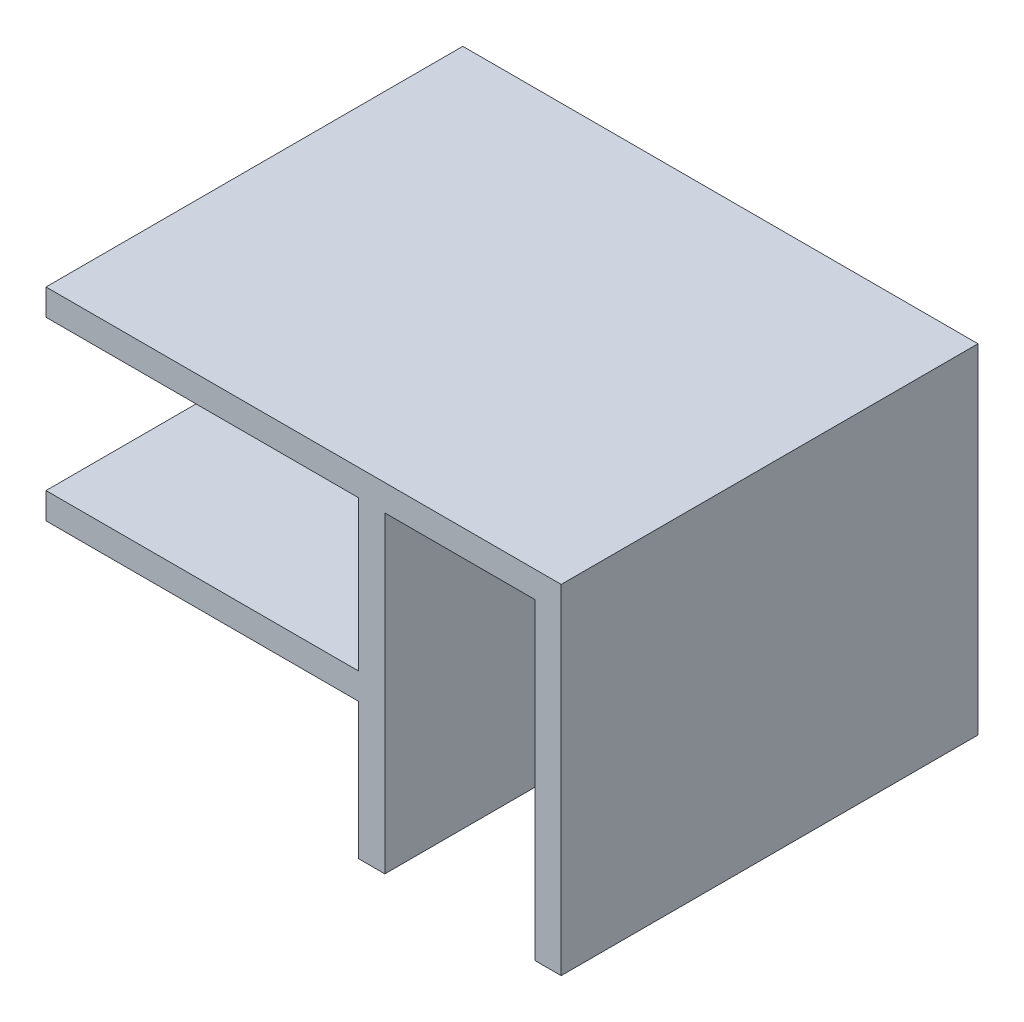
ISO-10303-21;
HEADER;
FILE_DESCRIPTION(('STEP AP214'),'2;1');
FILE_NAME('part.step','',(''),(''),'','','');
FILE_SCHEMA(('AUTOMOTIVE_DESIGN { 1 0 10303 214 1 1 1 1 }'));
ENDSEC;
DATA;
#1=APPLICATION_CONTEXT('core data for automotive mechanical design processes');
#2=APPLICATION_PROTOCOL_DEFINITION('international standard','automotive_design',2000,#1);
#3=PRODUCT_CONTEXT('',#1,'mechanical');
#4=PRODUCT('Part','Part','',(#3));
#5=PRODUCT_RELATED_PRODUCT_CATEGORY('part','',(#4));
#6=PRODUCT_DEFINITION_FORMATION('','',#4);
#7=PRODUCT_DEFINITION_CONTEXT('part definition',#1,'design');
#8=PRODUCT_DEFINITION('design','',#6,#7);
#9=PRODUCT_DEFINITION_SHAPE('','',#8);
#10=(LENGTH_UNIT() NAMED_UNIT(*) SI_UNIT(.MILLI.,.METRE.));
#11=(NAMED_UNIT(*) PLANE_ANGLE_UNIT() SI_UNIT($,.RADIAN.));
#12=(NAMED_UNIT(*) SI_UNIT($,.STERADIAN.) SOLID_ANGLE_UNIT());
#13=UNCERTAINTY_MEASURE_WITH_UNIT(LENGTH_MEASURE(1.E-05),#10,'distance_accuracy_value','');
#14=(GEOMETRIC_REPRESENTATION_CONTEXT(3) GLOBAL_UNCERTAINTY_ASSIGNED_CONTEXT((#13)) GLOBAL_UNIT_ASSIGNED_CONTEXT((#10,
#11,#12)) REPRESENTATION_CONTEXT('',''));
#15=CARTESIAN_POINT('',(0.,0.,0.));
#16=DIRECTION('',(0.,0.,1.));
#17=DIRECTION('',(1.,0.,0.));
#18=AXIS2_PLACEMENT_3D('',#15,#16,#17);
#19=CARTESIAN_POINT('',(0.8,0.,12.7));
#20=DIRECTION('',(0.,1.,0.));
#21=DIRECTION('',(-1.,0.,0.));
#22=AXIS2_PLACEMENT_3D('',#19,#20,#21);
#23=PLANE('',#22);
#24=DIRECTION('',(1.,0.,0.));
#25=VECTOR('',#24,1.);
#26=CARTESIAN_POINT('',(0.8,0.,0.));
#27=LINE('',#26,#25);
#28=CARTESIAN_POINT('',(0.,0.,0.));
#29=VERTEX_POINT('',#28);
#30=CARTESIAN_POINT('',(0.8,0.,0.));
#31=VERTEX_POINT('',#30);
#32=EDGE_CURVE('E165',#29,#31,#27,.T.);
#33=ORIENTED_EDGE('',*,*,#32,.T.);
#34=DIRECTION('',(0.,0.,-1.));
#35=VECTOR('',#34,1.);
#36=CARTESIAN_POINT('',(0.8,0.,12.7));
#37=LINE('',#36,#35);
#38=CARTESIAN_POINT('',(0.8,0.,12.7));
#39=VERTEX_POINT('',#38);
#40=EDGE_CURVE('E11',#39,#31,#37,.T.);
#41=ORIENTED_EDGE('',*,*,#40,.F.);
#42=DIRECTION('',(1.,0.,0.));
#43=VECTOR('',#42,1.);
#44=CARTESIAN_POINT('',(0.8,0.,12.7));
#45=LINE('',#44,#43);
#46=CARTESIAN_POINT('',(0.,0.,12.7));
#47=VERTEX_POINT('',#46);
#48=EDGE_CURVE('E191',#47,#39,#45,.T.);
#49=ORIENTED_EDGE('',*,*,#48,.F.);
#50=DIRECTION('',(0.,0.,-1.));
#51=VECTOR('',#50,1.);
#52=CARTESIAN_POINT('',(0.,0.,12.7));
#53=LINE('',#52,#51);
#54=EDGE_CURVE('E161',#47,#29,#53,.T.);
#55=ORIENTED_EDGE('',*,*,#54,.T.);
#56=EDGE_LOOP('',(#33,#41,#49,#55));
#57=FACE_BOUND('',#56,.T.);
#58=ADVANCED_FACE('F33',(#57),#23,.F.);
#59=CARTESIAN_POINT('',(0.799999999999998,9.525,12.7));
#60=DIRECTION('',(-1.,0.,0.));
#61=DIRECTION('',(0.,-1.,0.));
#62=AXIS2_PLACEMENT_3D('',#59,#60,#61);
#63=PLANE('',#62);
#64=DIRECTION('',(0.,1.,0.));
#65=VECTOR('',#64,1.);
#66=CARTESIAN_POINT('',(0.799999999999998,9.525,0.));
#67=LINE('',#66,#65);
#68=CARTESIAN_POINT('',(0.799999999999998,9.525,0.));
#69=VERTEX_POINT('',#68);
#70=EDGE_CURVE('E168',#31,#69,#67,.T.);
#71=ORIENTED_EDGE('',*,*,#70,.T.);
#72=DIRECTION('',(0.,0.,-1.));
#73=VECTOR('',#72,1.);
#74=CARTESIAN_POINT('',(0.799999999999998,9.525,12.7));
#75=LINE('',#74,#73);
#76=CARTESIAN_POINT('',(0.799999999999998,9.525,12.7));
#77=VERTEX_POINT('',#76);
#78=EDGE_CURVE('E41',#77,#69,#75,.T.);
#79=ORIENTED_EDGE('',*,*,#78,.F.);
#80=DIRECTION('',(0.,1.,0.));
#81=VECTOR('',#80,1.);
#82=CARTESIAN_POINT('',(0.799999999999998,9.525,12.7));
#83=LINE('',#82,#81);
#84=EDGE_CURVE('E110',#39,#77,#83,.T.);
#85=ORIENTED_EDGE('',*,*,#84,.F.);
#86=ORIENTED_EDGE('',*,*,#40,.T.);
#87=EDGE_LOOP('',(#71,#79,#85,#86));
#88=FACE_BOUND('',#87,.T.);
#89=ADVANCED_FACE('F279',(#88),#63,.F.);
#90=CARTESIAN_POINT('',(5.372,9.525,12.7));
#91=DIRECTION('',(0.,1.,0.));
#92=DIRECTION('',(0.,0.,1.));
#93=AXIS2_PLACEMENT_3D('',#90,#91,#92);
#94=PLANE('',#93);
#95=DIRECTION('',(1.,0.,0.));
#96=VECTOR('',#95,1.);
#97=CARTESIAN_POINT('',(5.372,9.525,0.));
#98=LINE('',#97,#96);
#99=CARTESIAN_POINT('',(5.372,9.525,0.));
#100=VERTEX_POINT('',#99);
#101=EDGE_CURVE('E170',#69,#100,#98,.T.);
#102=ORIENTED_EDGE('',*,*,#101,.T.);
#103=DIRECTION('',(0.,0.,-1.));
#104=VECTOR('',#103,1.);
#105=CARTESIAN_POINT('',(5.372,9.525,12.7));
#106=LINE('',#105,#104);
#107=CARTESIAN_POINT('',(5.372,9.525,12.7));
#108=VERTEX_POINT('',#107);
#109=EDGE_CURVE('E216',#108,#100,#106,.T.);
#110=ORIENTED_EDGE('',*,*,#109,.F.);
#111=DIRECTION('',(1.,0.,0.));
#112=VECTOR('',#111,1.);
#113=CARTESIAN_POINT('',(5.372,9.525,12.7));
#114=LINE('',#113,#112);
#115=EDGE_CURVE('E224',#77,#108,#114,.T.);
#116=ORIENTED_EDGE('',*,*,#115,.F.);
#117=ORIENTED_EDGE('',*,*,#78,.T.);
#118=EDGE_LOOP('',(#102,#110,#116,#117));
#119=FACE_BOUND('',#118,.T.);
#120=ADVANCED_FACE('F222',(#119),#94,.F.);
#121=CARTESIAN_POINT('',(5.372,0.,12.7));
#122=DIRECTION('',(1.,0.,0.));
#123=DIRECTION('',(0.,0.,-1.));
#124=AXIS2_PLACEMENT_3D('',#121,#122,#123);
#125=PLANE('',#124);
#126=DIRECTION('',(0.,-1.,0.));
#127=VECTOR('',#126,1.);
#128=CARTESIAN_POINT('',(5.372,0.,0.));
#129=LINE('',#128,#127);
#130=CARTESIAN_POINT('',(5.372,0.,0.));
#131=VERTEX_POINT('',#130);
#132=EDGE_CURVE('E172',#100,#131,#129,.T.);
#133=ORIENTED_EDGE('',*,*,#132,.T.);
#134=DIRECTION('',(0.,0.,-1.));
#135=VECTOR('',#134,1.);
#136=CARTESIAN_POINT('',(5.372,0.,12.7));
#137=LINE('',#136,#135);
#138=CARTESIAN_POINT('',(5.372,0.,12.7));
#139=VERTEX_POINT('',#138);
#140=EDGE_CURVE('E213',#139,#131,#137,.T.);
#141=ORIENTED_EDGE('',*,*,#140,.F.);
#142=DIRECTION('',(0.,-1.,0.));
#143=VECTOR('',#142,1.);
#144=CARTESIAN_POINT('',(5.372,0.,12.7));
#145=LINE('',#144,#143);
#146=EDGE_CURVE('E242',#108,#139,#145,.T.);
#147=ORIENTED_EDGE('',*,*,#146,.F.);
#148=ORIENTED_EDGE('',*,*,#109,.T.);
#149=EDGE_LOOP('',(#133,#141,#147,#148));
#150=FACE_BOUND('',#149,.T.);
#151=ADVANCED_FACE('F233',(#150),#125,.F.);
#152=CARTESIAN_POINT('',(6.172,0.,12.7));
#153=DIRECTION('',(0.,1.,0.));
#154=DIRECTION('',(-1.,0.,0.));
#155=AXIS2_PLACEMENT_3D('',#152,#153,#154);
#156=PLANE('',#155);
#157=DIRECTION('',(1.,0.,0.));
#158=VECTOR('',#157,1.);
#159=CARTESIAN_POINT('',(6.172,0.,0.));
#160=LINE('',#159,#158);
#161=CARTESIAN_POINT('',(6.172,0.,0.));
#162=VERTEX_POINT('',#161);
#163=EDGE_CURVE('E174',#131,#162,#160,.T.);
#164=ORIENTED_EDGE('',*,*,#163,.T.);
#165=DIRECTION('',(0.,0.,-1.));
#166=VECTOR('',#165,1.);
#167=CARTESIAN_POINT('',(6.172,0.,12.7));
#168=LINE('',#167,#166);
#169=CARTESIAN_POINT('',(6.172,0.,12.7));
#170=VERTEX_POINT('',#169);
#171=EDGE_CURVE('E210',#170,#162,#168,.T.);
#172=ORIENTED_EDGE('',*,*,#171,.F.);
#173=DIRECTION('',(1.,0.,0.));
#174=VECTOR('',#173,1.);
#175=CARTESIAN_POINT('',(6.172,0.,12.7));
#176=LINE('',#175,#174);
#177=EDGE_CURVE('E239',#139,#170,#176,.T.);
#178=ORIENTED_EDGE('',*,*,#177,.F.);
#179=ORIENTED_EDGE('',*,*,#140,.T.);
#180=EDGE_LOOP('',(#164,#172,#178,#179));
#181=FACE_BOUND('',#180,.T.);
#182=ADVANCED_FACE('F237',(#181),#156,.F.);
#183=CARTESIAN_POINT('',(6.172,10.325,12.7));
#184=DIRECTION('',(-1.,0.,0.));
#185=DIRECTION('',(0.,-1.,0.));
#186=AXIS2_PLACEMENT_3D('',#183,#184,#185);
#187=PLANE('',#186);
#188=DIRECTION('',(0.,1.,0.));
#189=VECTOR('',#188,1.);
#190=CARTESIAN_POINT('',(6.172,10.325,0.));
#191=LINE('',#190,#189);
#192=CARTESIAN_POINT('',(6.172,10.325,0.));
#193=VERTEX_POINT('',#192);
#194=EDGE_CURVE('E176',#162,#193,#191,.T.);
#195=ORIENTED_EDGE('',*,*,#194,.T.);
#196=DIRECTION('',(0.,0.,-1.));
#197=VECTOR('',#196,1.);
#198=CARTESIAN_POINT('',(6.172,10.325,12.7));
#199=LINE('',#198,#197);
#200=CARTESIAN_POINT('',(6.172,10.325,12.7));
#201=VERTEX_POINT('',#200);
#202=EDGE_CURVE('E207',#201,#193,#199,.T.);
#203=ORIENTED_EDGE('',*,*,#202,.F.);
#204=DIRECTION('',(0.,1.,0.));
#205=VECTOR('',#204,1.);
#206=CARTESIAN_POINT('',(6.172,10.325,12.7));
#207=LINE('',#206,#205);
#208=EDGE_CURVE('E241',#170,#201,#207,.T.);
#209=ORIENTED_EDGE('',*,*,#208,.F.);
#210=ORIENTED_EDGE('',*,*,#171,.T.);
#211=EDGE_LOOP('',(#195,#203,#209,#210));
#212=FACE_BOUND('',#211,.T.);
#213=ADVANCED_FACE('F292',(#212),#187,.F.);
#214=CARTESIAN_POINT('',(-9.525,10.325,12.7));
#215=DIRECTION('',(0.,-1.,0.));
#216=DIRECTION('',(0.,0.,-1.));
#217=AXIS2_PLACEMENT_3D('',#214,#215,#216);
#218=PLANE('',#217);
#219=DIRECTION('',(-1.,0.,0.));
#220=VECTOR('',#219,1.);
#221=CARTESIAN_POINT('',(-9.525,10.325,0.));
#222=LINE('',#221,#220);
#223=CARTESIAN_POINT('',(-9.525,10.325,0.));
#224=VERTEX_POINT('',#223);
#225=EDGE_CURVE('E178',#193,#224,#222,.T.);
#226=ORIENTED_EDGE('',*,*,#225,.T.);
#227=DIRECTION('',(0.,0.,-1.));
#228=VECTOR('',#227,1.);
#229=CARTESIAN_POINT('',(-9.525,10.325,12.7));
#230=LINE('',#229,#228);
#231=CARTESIAN_POINT('',(-9.525,10.325,12.7));
#232=VERTEX_POINT('',#231);
#233=EDGE_CURVE('E204',#232,#224,#230,.T.);
#234=ORIENTED_EDGE('',*,*,#233,.F.);
#235=DIRECTION('',(-1.,0.,0.));
#236=VECTOR('',#235,1.);
#237=CARTESIAN_POINT('',(-9.525,10.325,12.7));
#238=LINE('',#237,#236);
#239=EDGE_CURVE('E244',#201,#232,#238,.T.);
#240=ORIENTED_EDGE('',*,*,#239,.F.);
#241=ORIENTED_EDGE('',*,*,#202,.T.);
#242=EDGE_LOOP('',(#226,#234,#240,#241));
#243=FACE_BOUND('',#242,.T.);
#244=ADVANCED_FACE('F295',(#243),#218,.F.);
#245=CARTESIAN_POINT('',(-9.525,9.525,12.7));
#246=DIRECTION('',(1.,0.,0.));
#247=DIRECTION('',(0.,0.,-1.));
#248=AXIS2_PLACEMENT_3D('',#245,#246,#247);
#249=PLANE('',#248);
#250=DIRECTION('',(0.,-1.,0.));
#251=VECTOR('',#250,1.);
#252=CARTESIAN_POINT('',(-9.525,9.525,0.));
#253=LINE('',#252,#251);
#254=CARTESIAN_POINT('',(-9.525,9.525,0.));
#255=VERTEX_POINT('',#254);
#256=EDGE_CURVE('E180',#224,#255,#253,.T.);
#257=ORIENTED_EDGE('',*,*,#256,.T.);
#258=DIRECTION('',(0.,0.,-1.));
#259=VECTOR('',#258,1.);
#260=CARTESIAN_POINT('',(-9.525,9.525,12.7));
#261=LINE('',#260,#259);
#262=CARTESIAN_POINT('',(-9.525,9.525,12.7));
#263=VERTEX_POINT('',#262);
#264=EDGE_CURVE('E201',#263,#255,#261,.T.);
#265=ORIENTED_EDGE('',*,*,#264,.F.);
#266=DIRECTION('',(0.,-1.,0.));
#267=VECTOR('',#266,1.);
#268=CARTESIAN_POINT('',(-9.525,9.525,12.7));
#269=LINE('',#268,#267);
#270=EDGE_CURVE('E250',#232,#263,#269,.T.);
#271=ORIENTED_EDGE('',*,*,#270,.F.);
#272=ORIENTED_EDGE('',*,*,#233,.T.);
#273=EDGE_LOOP('',(#257,#265,#271,#272));
#274=FACE_BOUND('',#273,.T.);
#275=ADVANCED_FACE('F299',(#274),#249,.F.);
#276=CARTESIAN_POINT('',(0.,9.525,12.7));
#277=DIRECTION('',(0.,1.,0.));
#278=DIRECTION('',(-1.,0.,0.));
#279=AXIS2_PLACEMENT_3D('',#276,#277,#278);
#280=PLANE('',#279);
#281=DIRECTION('',(1.,0.,0.));
#282=VECTOR('',#281,1.);
#283=CARTESIAN_POINT('',(0.,9.525,0.));
#284=LINE('',#283,#282);
#285=CARTESIAN_POINT('',(0.,9.525,0.));
#286=VERTEX_POINT('',#285);
#287=EDGE_CURVE('E182',#255,#286,#284,.T.);
#288=ORIENTED_EDGE('',*,*,#287,.T.);
#289=DIRECTION('',(0.,0.,-1.));
#290=VECTOR('',#289,1.);
#291=CARTESIAN_POINT('',(0.,9.525,12.7));
#292=LINE('',#291,#290);
#293=CARTESIAN_POINT('',(0.,9.525,12.7));
#294=VERTEX_POINT('',#293);
#295=EDGE_CURVE('E198',#294,#286,#292,.T.);
#296=ORIENTED_EDGE('',*,*,#295,.F.);
#297=DIRECTION('',(1.,0.,0.));
#298=VECTOR('',#297,1.);
#299=CARTESIAN_POINT('',(0.,9.525,12.7));
#300=LINE('',#299,#298);
#301=EDGE_CURVE('E252',#263,#294,#300,.T.);
#302=ORIENTED_EDGE('',*,*,#301,.F.);
#303=ORIENTED_EDGE('',*,*,#264,.T.);
#304=EDGE_LOOP('',(#288,#296,#302,#303));
#305=FACE_BOUND('',#304,.T.);
#306=ADVANCED_FACE('F303',(#305),#280,.F.);
#307=CARTESIAN_POINT('',(0.,4.953,12.7));
#308=DIRECTION('',(1.,0.,0.));
#309=DIRECTION('',(0.,1.,0.));
#310=AXIS2_PLACEMENT_3D('',#307,#308,#309);
#311=PLANE('',#310);
#312=DIRECTION('',(0.,-1.,0.));
#313=VECTOR('',#312,1.);
#314=CARTESIAN_POINT('',(0.,4.953,0.));
#315=LINE('',#314,#313);
#316=CARTESIAN_POINT('',(0.,4.953,0.));
#317=VERTEX_POINT('',#316);
#318=EDGE_CURVE('E184',#286,#317,#315,.T.);
#319=ORIENTED_EDGE('',*,*,#318,.T.);
#320=DIRECTION('',(0.,0.,-1.));
#321=VECTOR('',#320,1.);
#322=CARTESIAN_POINT('',(0.,4.953,12.7));
#323=LINE('',#322,#321);
#324=CARTESIAN_POINT('',(0.,4.953,12.7));
#325=VERTEX_POINT('',#324);
#326=EDGE_CURVE('E195',#325,#317,#323,.T.);
#327=ORIENTED_EDGE('',*,*,#326,.F.);
#328=DIRECTION('',(0.,-1.,0.));
#329=VECTOR('',#328,1.);
#330=CARTESIAN_POINT('',(0.,4.953,12.7));
#331=LINE('',#330,#329);
#332=EDGE_CURVE('E254',#294,#325,#331,.T.);
#333=ORIENTED_EDGE('',*,*,#332,.F.);
#334=ORIENTED_EDGE('',*,*,#295,.T.);
#335=EDGE_LOOP('',(#319,#327,#333,#334));
#336=FACE_BOUND('',#335,.T.);
#337=ADVANCED_FACE('F260',(#336),#311,.F.);
#338=CARTESIAN_POINT('',(-9.525,4.953,12.7));
#339=DIRECTION('',(0.,-1.,0.));
#340=DIRECTION('',(0.,0.,-1.));
#341=AXIS2_PLACEMENT_3D('',#338,#339,#340);
#342=PLANE('',#341);
#343=DIRECTION('',(-1.,0.,0.));
#344=VECTOR('',#343,1.);
#345=CARTESIAN_POINT('',(-9.525,4.953,0.));
#346=LINE('',#345,#344);
#347=CARTESIAN_POINT('',(-9.525,4.953,0.));
#348=VERTEX_POINT('',#347);
#349=EDGE_CURVE('E186',#317,#348,#346,.T.);
#350=ORIENTED_EDGE('',*,*,#349,.T.);
#351=DIRECTION('',(0.,0.,-1.));
#352=VECTOR('',#351,1.);
#353=CARTESIAN_POINT('',(-9.525,4.953,12.7));
#354=LINE('',#353,#352);
#355=CARTESIAN_POINT('',(-9.525,4.953,12.7));
#356=VERTEX_POINT('',#355);
#357=EDGE_CURVE('E156',#356,#348,#354,.T.);
#358=ORIENTED_EDGE('',*,*,#357,.F.);
#359=DIRECTION('',(-1.,0.,0.));
#360=VECTOR('',#359,1.);
#361=CARTESIAN_POINT('',(-9.525,4.953,12.7));
#362=LINE('',#361,#360);
#363=EDGE_CURVE('E147',#325,#356,#362,.T.);
#364=ORIENTED_EDGE('',*,*,#363,.F.);
#365=ORIENTED_EDGE('',*,*,#326,.T.);
#366=EDGE_LOOP('',(#350,#358,#364,#365));
#367=FACE_BOUND('',#366,.T.);
#368=ADVANCED_FACE('F264',(#367),#342,.F.);
#369=CARTESIAN_POINT('',(-9.525,4.153,12.7));
#370=DIRECTION('',(1.,0.,0.));
#371=DIRECTION('',(0.,0.,-1.));
#372=AXIS2_PLACEMENT_3D('',#369,#370,#371);
#373=PLANE('',#372);
#374=DIRECTION('',(0.,-1.,0.));
#375=VECTOR('',#374,1.);
#376=CARTESIAN_POINT('',(-9.525,4.153,0.));
#377=LINE('',#376,#375);
#378=CARTESIAN_POINT('',(-9.525,4.153,0.));
#379=VERTEX_POINT('',#378);
#380=EDGE_CURVE('E155',#348,#379,#377,.T.);
#381=ORIENTED_EDGE('',*,*,#380,.T.);
#382=DIRECTION('',(0.,0.,-1.));
#383=VECTOR('',#382,1.);
#384=CARTESIAN_POINT('',(-9.525,4.153,12.7));
#385=LINE('',#384,#383);
#386=CARTESIAN_POINT('',(-9.525,4.153,12.7));
#387=VERTEX_POINT('',#386);
#388=EDGE_CURVE('E152',#387,#379,#385,.T.);
#389=ORIENTED_EDGE('',*,*,#388,.F.);
#390=DIRECTION('',(0.,-1.,0.));
#391=VECTOR('',#390,1.);
#392=CARTESIAN_POINT('',(-9.525,4.153,12.7));
#393=LINE('',#392,#391);
#394=EDGE_CURVE('E141',#356,#387,#393,.T.);
#395=ORIENTED_EDGE('',*,*,#394,.F.);
#396=ORIENTED_EDGE('',*,*,#357,.T.);
#397=EDGE_LOOP('',(#381,#389,#395,#396));
#398=FACE_BOUND('',#397,.T.);
#399=ADVANCED_FACE('F153',(#398),#373,.F.);
#400=CARTESIAN_POINT('',(0.,4.153,12.7));
#401=DIRECTION('',(0.,1.,0.));
#402=DIRECTION('',(-1.,0.,0.));
#403=AXIS2_PLACEMENT_3D('',#400,#401,#402);
#404=PLANE('',#403);
#405=DIRECTION('',(1.,0.,0.));
#406=VECTOR('',#405,1.);
#407=CARTESIAN_POINT('',(0.,4.153,0.));
#408=LINE('',#407,#406);
#409=CARTESIAN_POINT('',(0.,4.153,0.));
#410=VERTEX_POINT('',#409);
#411=EDGE_CURVE('E96',#379,#410,#408,.T.);
#412=ORIENTED_EDGE('',*,*,#411,.T.);
#413=DIRECTION('',(0.,0.,-1.));
#414=VECTOR('',#413,1.);
#415=CARTESIAN_POINT('',(0.,4.153,12.7));
#416=LINE('',#415,#414);
#417=CARTESIAN_POINT('',(0.,4.153,12.7));
#418=VERTEX_POINT('',#417);
#419=EDGE_CURVE('E157',#418,#410,#416,.T.);
#420=ORIENTED_EDGE('',*,*,#419,.F.);
#421=DIRECTION('',(1.,0.,0.));
#422=VECTOR('',#421,1.);
#423=CARTESIAN_POINT('',(0.,4.153,12.7));
#424=LINE('',#423,#422);
#425=EDGE_CURVE('E145',#387,#418,#424,.T.);
#426=ORIENTED_EDGE('',*,*,#425,.F.);
#427=ORIENTED_EDGE('',*,*,#388,.T.);
#428=EDGE_LOOP('',(#412,#420,#426,#427));
#429=FACE_BOUND('',#428,.T.);
#430=ADVANCED_FACE('F159',(#429),#404,.F.);
#431=CARTESIAN_POINT('',(0.,0.,12.7));
#432=DIRECTION('',(1.,0.,0.));
#433=DIRECTION('',(0.,1.,0.));
#434=AXIS2_PLACEMENT_3D('',#431,#432,#433);
#435=PLANE('',#434);
#436=DIRECTION('',(0.,-1.,0.));
#437=VECTOR('',#436,1.);
#438=CARTESIAN_POINT('',(0.,0.,0.));
#439=LINE('',#438,#437);
#440=EDGE_CURVE('E102',#410,#29,#439,.T.);
#441=ORIENTED_EDGE('',*,*,#440,.T.);
#442=ORIENTED_EDGE('',*,*,#54,.F.);
#443=DIRECTION('',(0.,-1.,0.));
#444=VECTOR('',#443,1.);
#445=CARTESIAN_POINT('',(0.,0.,12.7));
#446=LINE('',#445,#444);
#447=EDGE_CURVE('E49',#418,#47,#446,.T.);
#448=ORIENTED_EDGE('',*,*,#447,.F.);
#449=ORIENTED_EDGE('',*,*,#419,.T.);
#450=EDGE_LOOP('',(#441,#442,#448,#449));
#451=FACE_BOUND('',#450,.T.);
#452=ADVANCED_FACE('F268',(#451),#435,.F.);
#453=CARTESIAN_POINT('',(0.,0.,12.7));
#454=DIRECTION('',(0.,0.,-1.));
#455=DIRECTION('',(-1.,0.,0.));
#456=AXIS2_PLACEMENT_3D('',#453,#454,#455);
#457=PLANE('',#456);
#458=ORIENTED_EDGE('',*,*,#48,.T.);
#459=ORIENTED_EDGE('',*,*,#84,.T.);
#460=ORIENTED_EDGE('',*,*,#115,.T.);
#461=ORIENTED_EDGE('',*,*,#146,.T.);
#462=ORIENTED_EDGE('',*,*,#177,.T.);
#463=ORIENTED_EDGE('',*,*,#208,.T.);
#464=ORIENTED_EDGE('',*,*,#239,.T.);
#465=ORIENTED_EDGE('',*,*,#270,.T.);
#466=ORIENTED_EDGE('',*,*,#301,.T.);
#467=ORIENTED_EDGE('',*,*,#332,.T.);
#468=ORIENTED_EDGE('',*,*,#363,.T.);
#469=ORIENTED_EDGE('',*,*,#394,.T.);
#470=ORIENTED_EDGE('',*,*,#425,.T.);
#471=ORIENTED_EDGE('',*,*,#447,.T.);
#472=EDGE_LOOP('',(#458,#459,#460,#461,#462,#463,#464,#465,#466,#467,#468,#469,#470,#471));
#473=FACE_BOUND('',#472,.T.);
#474=ADVANCED_FACE('F143',(#473),#457,.F.);
#475=CARTESIAN_POINT('',(0.,0.,0.));
#476=DIRECTION('',(0.,0.,-1.));
#477=DIRECTION('',(-1.,0.,0.));
#478=AXIS2_PLACEMENT_3D('',#475,#476,#477);
#479=PLANE('',#478);
#480=ORIENTED_EDGE('',*,*,#32,.F.);
#481=ORIENTED_EDGE('',*,*,#440,.F.);
#482=ORIENTED_EDGE('',*,*,#411,.F.);
#483=ORIENTED_EDGE('',*,*,#380,.F.);
#484=ORIENTED_EDGE('',*,*,#349,.F.);
#485=ORIENTED_EDGE('',*,*,#318,.F.);
#486=ORIENTED_EDGE('',*,*,#287,.F.);
#487=ORIENTED_EDGE('',*,*,#256,.F.);
#488=ORIENTED_EDGE('',*,*,#225,.F.);
#489=ORIENTED_EDGE('',*,*,#194,.F.);
#490=ORIENTED_EDGE('',*,*,#163,.F.);
#491=ORIENTED_EDGE('',*,*,#132,.F.);
#492=ORIENTED_EDGE('',*,*,#101,.F.);
#493=ORIENTED_EDGE('',*,*,#70,.F.);
#494=EDGE_LOOP('',(#480,#481,#482,#483,#484,#485,#486,#487,#488,#489,#490,#491,#492,#493));
#495=FACE_BOUND('',#494,.T.);
#496=ADVANCED_FACE('F228',(#495),#479,.T.);
#497=CLOSED_SHELL('',(#58,#89,#120,#151,#182,#213,#244,#275,#306,#337,#368,#399,#430,#452,#474,#496));
#498=MANIFOLD_SOLID_BREP('B2',#497);
#499=ADVANCED_BREP_SHAPE_REPRESENTATION('',(#18,#498),#14);
#500=SHAPE_DEFINITION_REPRESENTATION(#9,#499);
ENDSEC;
END-ISO-10303-21;
